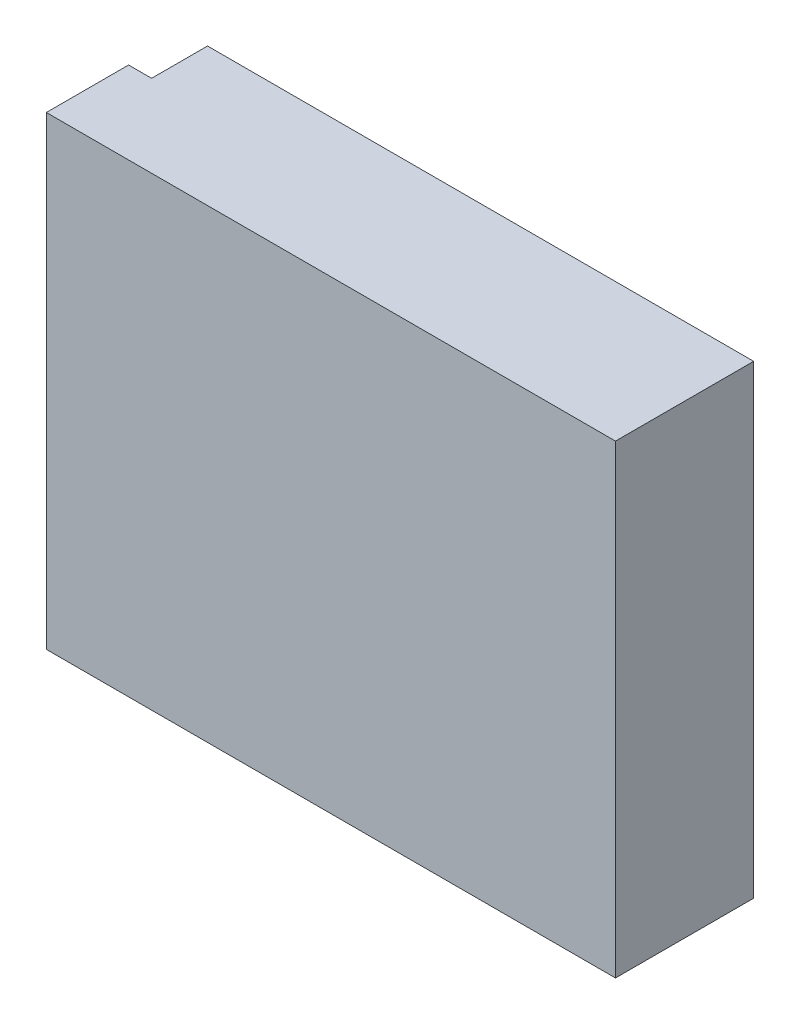
ISO-10303-21;
HEADER;
FILE_DESCRIPTION(('STEP AP214'),'2;1');
FILE_NAME('part.step','',(''),(''),'','','');
FILE_SCHEMA(('AUTOMOTIVE_DESIGN { 1 0 10303 214 1 1 1 1 }'));
ENDSEC;
DATA;
#1=APPLICATION_CONTEXT('core data for automotive mechanical design processes');
#2=APPLICATION_PROTOCOL_DEFINITION('international standard','automotive_design',2000,#1);
#3=PRODUCT_CONTEXT('',#1,'mechanical');
#4=PRODUCT('Part','Part','',(#3));
#5=PRODUCT_RELATED_PRODUCT_CATEGORY('part','',(#4));
#6=PRODUCT_DEFINITION_FORMATION('','',#4);
#7=PRODUCT_DEFINITION_CONTEXT('part definition',#1,'design');
#8=PRODUCT_DEFINITION('design','',#6,#7);
#9=PRODUCT_DEFINITION_SHAPE('','',#8);
#10=(LENGTH_UNIT() NAMED_UNIT(*) SI_UNIT(.MILLI.,.METRE.));
#11=(NAMED_UNIT(*) PLANE_ANGLE_UNIT() SI_UNIT($,.RADIAN.));
#12=(NAMED_UNIT(*) SI_UNIT($,.STERADIAN.) SOLID_ANGLE_UNIT());
#13=UNCERTAINTY_MEASURE_WITH_UNIT(LENGTH_MEASURE(1.E-05),#10,'distance_accuracy_value','');
#14=(GEOMETRIC_REPRESENTATION_CONTEXT(3) GLOBAL_UNCERTAINTY_ASSIGNED_CONTEXT((#13)) GLOBAL_UNIT_ASSIGNED_CONTEXT((#10,
#11,#12)) REPRESENTATION_CONTEXT('',''));
#15=CARTESIAN_POINT('',(0.,0.,0.));
#16=DIRECTION('',(0.,0.,1.));
#17=DIRECTION('',(1.,0.,0.));
#18=AXIS2_PLACEMENT_3D('',#15,#16,#17);
#19=CARTESIAN_POINT('',(6.3246,5.588,0.762));
#20=DIRECTION('',(0.,0.,1.));
#21=DIRECTION('',(1.,0.,0.));
#22=AXIS2_PLACEMENT_3D('',#19,#20,#21);
#23=PLANE('',#22);
#24=DIRECTION('',(1.,0.,0.));
#25=VECTOR('',#24,1.);
#26=CARTESIAN_POINT('',(0.,0.4064,0.762));
#27=LINE('',#26,#25);
#28=CARTESIAN_POINT('',(0.,0.4064,0.762));
#29=VERTEX_POINT('',#28);
#30=CARTESIAN_POINT('',(12.6492,0.4064,0.762));
#31=VERTEX_POINT('',#30);
#32=EDGE_CURVE('E27',#29,#31,#27,.T.);
#33=ORIENTED_EDGE('',*,*,#32,.F.);
#34=DIRECTION('',(0.,-1.,0.));
#35=VECTOR('',#34,1.);
#36=CARTESIAN_POINT('',(0.,11.176,0.762));
#37=LINE('',#36,#35);
#38=CARTESIAN_POINT('',(0.,11.176,0.762));
#39=VERTEX_POINT('',#38);
#40=EDGE_CURVE('E77',#39,#29,#37,.T.);
#41=ORIENTED_EDGE('',*,*,#40,.F.);
#42=DIRECTION('',(-1.,0.,0.));
#43=VECTOR('',#42,1.);
#44=CARTESIAN_POINT('',(12.6492,11.176,0.762));
#45=LINE('',#44,#43);
#46=CARTESIAN_POINT('',(12.6492,11.176,0.762));
#47=VERTEX_POINT('',#46);
#48=EDGE_CURVE('E94',#47,#39,#45,.T.);
#49=ORIENTED_EDGE('',*,*,#48,.F.);
#50=DIRECTION('',(0.,1.,0.));
#51=VECTOR('',#50,1.);
#52=CARTESIAN_POINT('',(12.6492,0.,0.762));
#53=LINE('',#52,#51);
#54=EDGE_CURVE('E79',#31,#47,#53,.T.);
#55=ORIENTED_EDGE('',*,*,#54,.F.);
#56=EDGE_LOOP('',(#33,#41,#49,#55));
#57=FACE_BOUND('',#56,.T.);
#58=ADVANCED_FACE('F17',(#57),#23,.F.);
#59=CARTESIAN_POINT('',(6.3246,5.588,3.9624));
#60=DIRECTION('',(0.,0.,1.));
#61=DIRECTION('',(1.,0.,0.));
#62=AXIS2_PLACEMENT_3D('',#59,#60,#61);
#63=PLANE('',#62);
#64=DIRECTION('',(-1.,0.,0.));
#65=VECTOR('',#64,1.);
#66=CARTESIAN_POINT('',(0.,0.4064,3.9624));
#67=LINE('',#66,#65);
#68=CARTESIAN_POINT('',(12.6492,0.4064,3.9624));
#69=VERTEX_POINT('',#68);
#70=CARTESIAN_POINT('',(-0.5334,0.4064,3.9624));
#71=VERTEX_POINT('',#70);
#72=EDGE_CURVE('E11',#69,#71,#67,.T.);
#73=ORIENTED_EDGE('',*,*,#72,.F.);
#74=DIRECTION('',(0.,1.,0.));
#75=VECTOR('',#74,1.);
#76=CARTESIAN_POINT('',(12.6492,0.,3.9624));
#77=LINE('',#76,#75);
#78=CARTESIAN_POINT('',(12.6492,11.176,3.9624));
#79=VERTEX_POINT('',#78);
#80=EDGE_CURVE('E130',#69,#79,#77,.T.);
#81=ORIENTED_EDGE('',*,*,#80,.T.);
#82=DIRECTION('',(-1.,0.,0.));
#83=VECTOR('',#82,1.);
#84=CARTESIAN_POINT('',(12.6492,11.176,3.9624));
#85=LINE('',#84,#83);
#86=CARTESIAN_POINT('',(-0.5334,11.176,3.9624));
#87=VERTEX_POINT('',#86);
#88=EDGE_CURVE('E118',#79,#87,#85,.T.);
#89=ORIENTED_EDGE('',*,*,#88,.T.);
#90=DIRECTION('',(0.,-1.,0.));
#91=VECTOR('',#90,1.);
#92=CARTESIAN_POINT('',(-0.5334,2.794,3.9624));
#93=LINE('',#92,#91);
#94=EDGE_CURVE('E113',#87,#71,#93,.T.);
#95=ORIENTED_EDGE('',*,*,#94,.T.);
#96=EDGE_LOOP('',(#73,#81,#89,#95));
#97=FACE_BOUND('',#96,.T.);
#98=ADVANCED_FACE('F143',(#97),#63,.T.);
#99=CARTESIAN_POINT('',(0.,0.4064,0.));
#100=DIRECTION('',(0.,-1.,0.));
#101=DIRECTION('',(0.,0.,-1.));
#102=AXIS2_PLACEMENT_3D('',#99,#100,#101);
#103=PLANE('',#102);
#104=ORIENTED_EDGE('',*,*,#32,.T.);
#105=DIRECTION('',(0.,0.,1.));
#106=VECTOR('',#105,1.);
#107=CARTESIAN_POINT('',(12.6492,0.4064,0.));
#108=LINE('',#107,#106);
#109=EDGE_CURVE('E83',#31,#69,#108,.T.);
#110=ORIENTED_EDGE('',*,*,#109,.T.);
#111=ORIENTED_EDGE('',*,*,#72,.T.);
#112=DIRECTION('',(0.,0.,-1.));
#113=VECTOR('',#112,1.);
#114=CARTESIAN_POINT('',(-0.5334,0.4064,2.53365));
#115=LINE('',#114,#113);
#116=CARTESIAN_POINT('',(-0.5334,0.4064,2.0574));
#117=VERTEX_POINT('',#116);
#118=EDGE_CURVE('E109',#71,#117,#115,.T.);
#119=ORIENTED_EDGE('',*,*,#118,.T.);
#120=DIRECTION('',(-1.,0.,0.));
#121=VECTOR('',#120,1.);
#122=CARTESIAN_POINT('',(0.,0.4064,2.0574));
#123=LINE('',#122,#121);
#124=CARTESIAN_POINT('',(0.,0.4064,2.0574));
#125=VERTEX_POINT('',#124);
#126=EDGE_CURVE('E89',#125,#117,#123,.T.);
#127=ORIENTED_EDGE('',*,*,#126,.F.);
#128=DIRECTION('',(0.,0.,1.));
#129=VECTOR('',#128,1.);
#130=CARTESIAN_POINT('',(0.,0.4064,0.));
#131=LINE('',#130,#129);
#132=EDGE_CURVE('E85',#29,#125,#131,.T.);
#133=ORIENTED_EDGE('',*,*,#132,.F.);
#134=EDGE_LOOP('',(#104,#110,#111,#119,#127,#133));
#135=FACE_BOUND('',#134,.T.);
#136=ADVANCED_FACE('F86',(#135),#103,.T.);
#137=CARTESIAN_POINT('',(12.6492,0.,0.));
#138=DIRECTION('',(1.,0.,0.));
#139=DIRECTION('',(0.,1.,0.));
#140=AXIS2_PLACEMENT_3D('',#137,#138,#139);
#141=PLANE('',#140);
#142=ORIENTED_EDGE('',*,*,#54,.T.);
#143=DIRECTION('',(0.,0.,1.));
#144=VECTOR('',#143,1.);
#145=CARTESIAN_POINT('',(12.6492,11.176,0.));
#146=LINE('',#145,#144);
#147=EDGE_CURVE('E124',#47,#79,#146,.T.);
#148=ORIENTED_EDGE('',*,*,#147,.T.);
#149=ORIENTED_EDGE('',*,*,#80,.F.);
#150=ORIENTED_EDGE('',*,*,#109,.F.);
#151=EDGE_LOOP('',(#142,#148,#149,#150));
#152=FACE_BOUND('',#151,.T.);
#153=ADVANCED_FACE('F140',(#152),#141,.T.);
#154=CARTESIAN_POINT('',(12.6492,11.176,0.));
#155=DIRECTION('',(0.,1.,0.));
#156=DIRECTION('',(1.,0.,0.));
#157=AXIS2_PLACEMENT_3D('',#154,#155,#156);
#158=PLANE('',#157);
#159=ORIENTED_EDGE('',*,*,#48,.T.);
#160=DIRECTION('',(0.,0.,1.));
#161=VECTOR('',#160,1.);
#162=CARTESIAN_POINT('',(0.,11.176,0.));
#163=LINE('',#162,#161);
#164=CARTESIAN_POINT('',(0.,11.176,2.0574));
#165=VERTEX_POINT('',#164);
#166=EDGE_CURVE('E98',#39,#165,#163,.T.);
#167=ORIENTED_EDGE('',*,*,#166,.T.);
#168=DIRECTION('',(-1.,0.,0.));
#169=VECTOR('',#168,1.);
#170=CARTESIAN_POINT('',(0.,11.176,2.0574));
#171=LINE('',#170,#169);
#172=CARTESIAN_POINT('',(-0.5334,11.176,2.0574));
#173=VERTEX_POINT('',#172);
#174=EDGE_CURVE('E119',#165,#173,#171,.T.);
#175=ORIENTED_EDGE('',*,*,#174,.T.);
#176=DIRECTION('',(0.,0.,1.));
#177=VECTOR('',#176,1.);
#178=CARTESIAN_POINT('',(-0.5334,11.176,3.48615));
#179=LINE('',#178,#177);
#180=EDGE_CURVE('E105',#173,#87,#179,.T.);
#181=ORIENTED_EDGE('',*,*,#180,.T.);
#182=ORIENTED_EDGE('',*,*,#88,.F.);
#183=ORIENTED_EDGE('',*,*,#147,.F.);
#184=EDGE_LOOP('',(#159,#167,#175,#181,#182,#183));
#185=FACE_BOUND('',#184,.T.);
#186=ADVANCED_FACE('F178',(#185),#158,.T.);
#187=CARTESIAN_POINT('',(0.,11.176,0.));
#188=DIRECTION('',(-1.,0.,0.));
#189=DIRECTION('',(0.,1.,0.));
#190=AXIS2_PLACEMENT_3D('',#187,#188,#189);
#191=PLANE('',#190);
#192=DIRECTION('',(0.,1.,0.));
#193=VECTOR('',#192,1.);
#194=CARTESIAN_POINT('',(0.,11.176,2.0574));
#195=LINE('',#194,#193);
#196=EDGE_CURVE('E112',#125,#165,#195,.T.);
#197=ORIENTED_EDGE('',*,*,#196,.T.);
#198=ORIENTED_EDGE('',*,*,#166,.F.);
#199=ORIENTED_EDGE('',*,*,#40,.T.);
#200=ORIENTED_EDGE('',*,*,#132,.T.);
#201=EDGE_LOOP('',(#197,#198,#199,#200));
#202=FACE_BOUND('',#201,.T.);
#203=ADVANCED_FACE('F96',(#202),#191,.T.);
#204=CARTESIAN_POINT('',(-0.5334,5.588,3.0099));
#205=DIRECTION('',(-1.,0.,0.));
#206=DIRECTION('',(0.,1.,0.));
#207=AXIS2_PLACEMENT_3D('',#204,#205,#206);
#208=PLANE('',#207);
#209=DIRECTION('',(0.,1.,0.));
#210=VECTOR('',#209,1.);
#211=CARTESIAN_POINT('',(-0.5334,8.382,2.0574));
#212=LINE('',#211,#210);
#213=EDGE_CURVE('E123',#117,#173,#212,.T.);
#214=ORIENTED_EDGE('',*,*,#213,.F.);
#215=ORIENTED_EDGE('',*,*,#118,.F.);
#216=ORIENTED_EDGE('',*,*,#94,.F.);
#217=ORIENTED_EDGE('',*,*,#180,.F.);
#218=EDGE_LOOP('',(#214,#215,#216,#217));
#219=FACE_BOUND('',#218,.T.);
#220=ADVANCED_FACE('F158',(#219),#208,.T.);
#221=CARTESIAN_POINT('',(0.,11.176,2.0574));
#222=DIRECTION('',(0.,0.,-1.));
#223=DIRECTION('',(0.,-1.,0.));
#224=AXIS2_PLACEMENT_3D('',#221,#222,#223);
#225=PLANE('',#224);
#226=ORIENTED_EDGE('',*,*,#213,.T.);
#227=ORIENTED_EDGE('',*,*,#174,.F.);
#228=ORIENTED_EDGE('',*,*,#196,.F.);
#229=ORIENTED_EDGE('',*,*,#126,.T.);
#230=EDGE_LOOP('',(#226,#227,#228,#229));
#231=FACE_BOUND('',#230,.T.);
#232=ADVANCED_FACE('F19',(#231),#225,.T.);
#233=CLOSED_SHELL('',(#58,#98,#136,#153,#186,#203,#220,#232));
#234=MANIFOLD_SOLID_BREP('B1',#233);
#235=ADVANCED_BREP_SHAPE_REPRESENTATION('',(#18,#234),#14);
#236=SHAPE_DEFINITION_REPRESENTATION(#9,#235);
ENDSEC;
END-ISO-10303-21;
